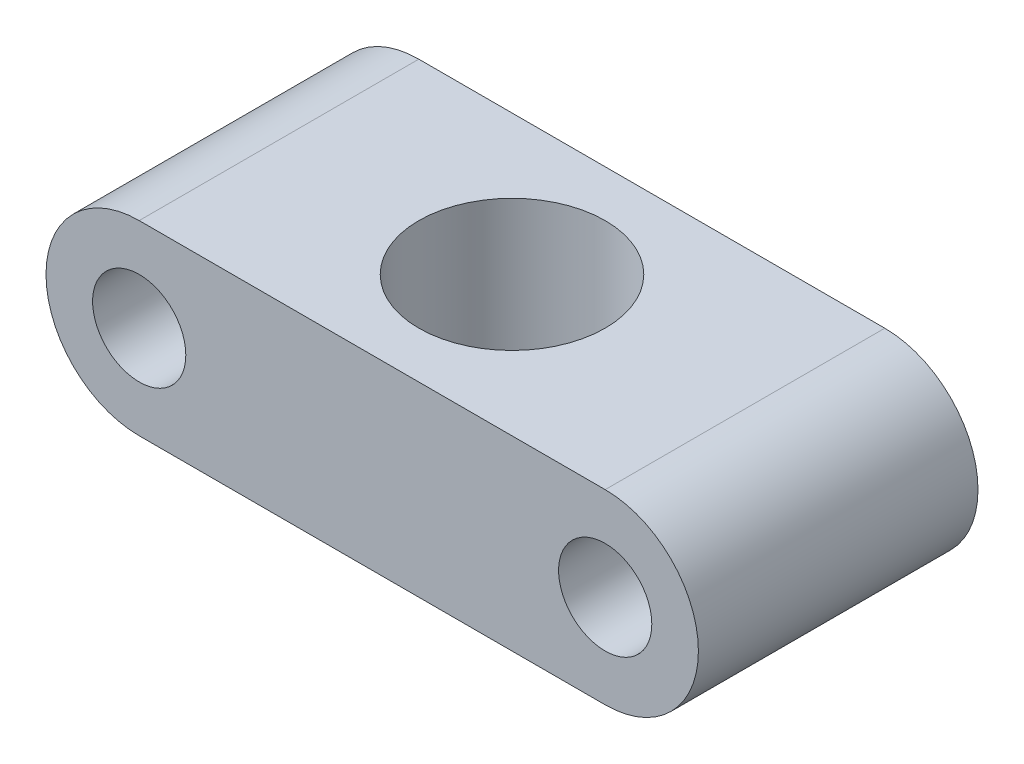
ISO-10303-21;
HEADER;
FILE_DESCRIPTION(('STEP AP214'),'2;1');
FILE_NAME('part.step','',(''),(''),'','','');
FILE_SCHEMA(('AUTOMOTIVE_DESIGN { 1 0 10303 214 1 1 1 1 }'));
ENDSEC;
DATA;
#1=APPLICATION_CONTEXT('core data for automotive mechanical design processes');
#2=APPLICATION_PROTOCOL_DEFINITION('international standard','automotive_design',2000,#1);
#3=PRODUCT_CONTEXT('',#1,'mechanical');
#4=PRODUCT('Part','Part','',(#3));
#5=PRODUCT_RELATED_PRODUCT_CATEGORY('part','',(#4));
#6=PRODUCT_DEFINITION_FORMATION('','',#4);
#7=PRODUCT_DEFINITION_CONTEXT('part definition',#1,'design');
#8=PRODUCT_DEFINITION('design','',#6,#7);
#9=PRODUCT_DEFINITION_SHAPE('','',#8);
#10=(LENGTH_UNIT() NAMED_UNIT(*) SI_UNIT(.MILLI.,.METRE.));
#11=(NAMED_UNIT(*) PLANE_ANGLE_UNIT() SI_UNIT($,.RADIAN.));
#12=(NAMED_UNIT(*) SI_UNIT($,.STERADIAN.) SOLID_ANGLE_UNIT());
#13=UNCERTAINTY_MEASURE_WITH_UNIT(LENGTH_MEASURE(1.E-05),#10,'distance_accuracy_value','');
#14=(GEOMETRIC_REPRESENTATION_CONTEXT(3) GLOBAL_UNCERTAINTY_ASSIGNED_CONTEXT((#13)) GLOBAL_UNIT_ASSIGNED_CONTEXT((#10,
#11,#12)) REPRESENTATION_CONTEXT('',''));
#15=CARTESIAN_POINT('',(0.,0.,0.));
#16=DIRECTION('',(0.,0.,1.));
#17=DIRECTION('',(1.,0.,0.));
#18=AXIS2_PLACEMENT_3D('',#15,#16,#17);
#19=CARTESIAN_POINT('',(-45.9443800806097,11.6908726675388,30.));
#20=DIRECTION('',(0.,0.,1.));
#21=DIRECTION('',(1.,0.,0.));
#22=AXIS2_PLACEMENT_3D('',#19,#20,#21);
#23=PLANE('',#22);
#24=CARTESIAN_POINT('',(-45.9443800806097,11.6908726675388,30.));
#25=DIRECTION('',(0.,0.,1.));
#26=DIRECTION('',(1.,0.,0.));
#27=AXIS2_PLACEMENT_3D('',#24,#25,#26);
#28=CIRCLE('',#27,5.);
#29=CARTESIAN_POINT('',(-40.9443800806097,11.6908726675388,30.));
#30=VERTEX_POINT('',#29);
#31=EDGE_CURVE('E100',#30,#30,#28,.T.);
#32=ORIENTED_EDGE('',*,*,#31,.F.);
#33=EDGE_LOOP('',(#32));
#34=FACE_BOUND('',#33,.T.);
#35=CARTESIAN_POINT('',(-45.9443800806097,11.6908726675388,30.));
#36=DIRECTION('',(0.,0.,1.));
#37=DIRECTION('',(1.,0.,0.));
#38=AXIS2_PLACEMENT_3D('',#35,#36,#37);
#39=CIRCLE('',#38,10.);
#40=CARTESIAN_POINT('',(-45.9443800806097,21.6908726675389,30.));
#41=VERTEX_POINT('',#40);
#42=CARTESIAN_POINT('',(-45.9443800806097,1.69087266753885,30.));
#43=VERTEX_POINT('',#42);
#44=EDGE_CURVE('E85',#41,#43,#39,.T.);
#45=ORIENTED_EDGE('',*,*,#44,.T.);
#46=DIRECTION('',(1.,0.,0.));
#47=VECTOR('',#46,1.);
#48=CARTESIAN_POINT('',(-45.9443800806097,1.69087266753885,30.));
#49=LINE('',#48,#47);
#50=CARTESIAN_POINT('',(4.05561991939028,1.69087266753885,30.));
#51=VERTEX_POINT('',#50);
#52=EDGE_CURVE('E80',#43,#51,#49,.T.);
#53=ORIENTED_EDGE('',*,*,#52,.T.);
#54=CARTESIAN_POINT('',(4.05561991939028,11.6908726675388,30.));
#55=DIRECTION('',(0.,0.,1.));
#56=DIRECTION('',(1.,0.,0.));
#57=AXIS2_PLACEMENT_3D('',#54,#55,#56);
#58=CIRCLE('',#57,10.);
#59=CARTESIAN_POINT('',(4.05561991939028,21.6908726675389,30.));
#60=VERTEX_POINT('',#59);
#61=EDGE_CURVE('E83',#51,#60,#58,.T.);
#62=ORIENTED_EDGE('',*,*,#61,.T.);
#63=DIRECTION('',(-1.,0.,0.));
#64=VECTOR('',#63,1.);
#65=CARTESIAN_POINT('',(-45.9443800806097,21.6908726675389,30.));
#66=LINE('',#65,#64);
#67=EDGE_CURVE('E50',#60,#41,#66,.T.);
#68=ORIENTED_EDGE('',*,*,#67,.T.);
#69=EDGE_LOOP('',(#45,#53,#62,#68));
#70=FACE_BOUND('',#69,.T.);
#71=CARTESIAN_POINT('',(4.05561991939028,11.6908726675388,30.));
#72=DIRECTION('',(0.,0.,1.));
#73=DIRECTION('',(1.,0.,0.));
#74=AXIS2_PLACEMENT_3D('',#71,#72,#73);
#75=CIRCLE('',#74,5.);
#76=CARTESIAN_POINT('',(9.05561991939028,11.6908726675388,30.));
#77=VERTEX_POINT('',#76);
#78=EDGE_CURVE('E115',#77,#77,#75,.T.);
#79=ORIENTED_EDGE('',*,*,#78,.F.);
#80=EDGE_LOOP('',(#79));
#81=FACE_BOUND('',#80,.T.);
#82=ADVANCED_FACE('F33',(#34,#70,#81),#23,.T.);
#83=CARTESIAN_POINT('',(-45.9443800806097,11.6908726675388,0.));
#84=DIRECTION('',(0.,0.,1.));
#85=DIRECTION('',(1.,0.,0.));
#86=AXIS2_PLACEMENT_3D('',#83,#84,#85);
#87=PLANE('',#86);
#88=CARTESIAN_POINT('',(-45.9443800806097,11.6908726675388,0.));
#89=DIRECTION('',(0.,0.,1.));
#90=DIRECTION('',(1.,0.,0.));
#91=AXIS2_PLACEMENT_3D('',#88,#89,#90);
#92=CIRCLE('',#91,10.);
#93=CARTESIAN_POINT('',(-45.9443800806097,21.6908726675389,0.));
#94=VERTEX_POINT('',#93);
#95=CARTESIAN_POINT('',(-45.9443800806097,1.69087266753885,0.));
#96=VERTEX_POINT('',#95);
#97=EDGE_CURVE('E97',#94,#96,#92,.T.);
#98=ORIENTED_EDGE('',*,*,#97,.F.);
#99=DIRECTION('',(-1.,0.,0.));
#100=VECTOR('',#99,1.);
#101=CARTESIAN_POINT('',(-45.9443800806097,21.6908726675389,0.));
#102=LINE('',#101,#100);
#103=CARTESIAN_POINT('',(4.05561991939028,21.6908726675389,0.));
#104=VERTEX_POINT('',#103);
#105=EDGE_CURVE('E73',#104,#94,#102,.T.);
#106=ORIENTED_EDGE('',*,*,#105,.F.);
#107=CARTESIAN_POINT('',(4.05561991939028,11.6908726675388,0.));
#108=DIRECTION('',(0.,0.,1.));
#109=DIRECTION('',(1.,0.,0.));
#110=AXIS2_PLACEMENT_3D('',#107,#108,#109);
#111=CIRCLE('',#110,10.);
#112=CARTESIAN_POINT('',(4.05561991939028,1.69087266753885,0.));
#113=VERTEX_POINT('',#112);
#114=EDGE_CURVE('E67',#113,#104,#111,.T.);
#115=ORIENTED_EDGE('',*,*,#114,.F.);
#116=DIRECTION('',(1.,0.,0.));
#117=VECTOR('',#116,1.);
#118=CARTESIAN_POINT('',(-45.9443800806097,1.69087266753885,0.));
#119=LINE('',#118,#117);
#120=EDGE_CURVE('E89',#96,#113,#119,.T.);
#121=ORIENTED_EDGE('',*,*,#120,.F.);
#122=EDGE_LOOP('',(#98,#106,#115,#121));
#123=FACE_BOUND('',#122,.T.);
#124=CARTESIAN_POINT('',(-45.9443800806097,11.6908726675388,0.));
#125=DIRECTION('',(0.,0.,1.));
#126=DIRECTION('',(1.,0.,0.));
#127=AXIS2_PLACEMENT_3D('',#124,#125,#126);
#128=CIRCLE('',#127,5.);
#129=CARTESIAN_POINT('',(-40.9443800806097,11.6908726675388,0.));
#130=VERTEX_POINT('',#129);
#131=EDGE_CURVE('E112',#130,#130,#128,.T.);
#132=ORIENTED_EDGE('',*,*,#131,.T.);
#133=EDGE_LOOP('',(#132));
#134=FACE_BOUND('',#133,.T.);
#135=CARTESIAN_POINT('',(4.05561991939028,11.6908726675388,0.));
#136=DIRECTION('',(0.,0.,1.));
#137=DIRECTION('',(1.,0.,0.));
#138=AXIS2_PLACEMENT_3D('',#135,#136,#137);
#139=CIRCLE('',#138,5.);
#140=CARTESIAN_POINT('',(9.05561991939028,11.6908726675388,0.));
#141=VERTEX_POINT('',#140);
#142=EDGE_CURVE('E118',#141,#141,#139,.T.);
#143=ORIENTED_EDGE('',*,*,#142,.T.);
#144=EDGE_LOOP('',(#143));
#145=FACE_BOUND('',#144,.T.);
#146=ADVANCED_FACE('F108',(#123,#134,#145),#87,.F.);
#147=CARTESIAN_POINT('',(-45.9443800806097,11.6908726675388,30.));
#148=DIRECTION('',(0.,0.,-1.));
#149=DIRECTION('',(-1.,0.,0.));
#150=AXIS2_PLACEMENT_3D('',#147,#148,#149);
#151=CYLINDRICAL_SURFACE('',#150,10.);
#152=ORIENTED_EDGE('',*,*,#97,.T.);
#153=DIRECTION('',(0.,0.,-1.));
#154=VECTOR('',#153,1.);
#155=CARTESIAN_POINT('',(-45.9443800806097,1.69087266753885,30.));
#156=LINE('',#155,#154);
#157=EDGE_CURVE('E11',#43,#96,#156,.T.);
#158=ORIENTED_EDGE('',*,*,#157,.F.);
#159=ORIENTED_EDGE('',*,*,#44,.F.);
#160=DIRECTION('',(0.,0.,-1.));
#161=VECTOR('',#160,1.);
#162=CARTESIAN_POINT('',(-45.9443800806097,21.6908726675389,30.));
#163=LINE('',#162,#161);
#164=EDGE_CURVE('E93',#41,#94,#163,.T.);
#165=ORIENTED_EDGE('',*,*,#164,.T.);
#166=EDGE_LOOP('',(#152,#158,#159,#165));
#167=FACE_BOUND('',#166,.T.);
#168=ADVANCED_FACE('F35',(#167),#151,.T.);
#169=CARTESIAN_POINT('',(-45.9443800806097,1.69087266753885,30.));
#170=DIRECTION('',(0.,1.,0.));
#171=DIRECTION('',(0.,0.,1.));
#172=AXIS2_PLACEMENT_3D('',#169,#170,#171);
#173=PLANE('',#172);
#174=CARTESIAN_POINT('',(-20.9443800806097,1.69087266753885,15.));
#175=DIRECTION('',(0.,1.,0.));
#176=DIRECTION('',(0.,0.,1.));
#177=AXIS2_PLACEMENT_3D('',#174,#175,#176);
#178=CIRCLE('',#177,10.);
#179=CARTESIAN_POINT('',(-20.9443800806097,1.69087266753885,25.));
#180=VERTEX_POINT('',#179);
#181=EDGE_CURVE('E121',#180,#180,#178,.T.);
#182=ORIENTED_EDGE('',*,*,#181,.T.);
#183=EDGE_LOOP('',(#182));
#184=FACE_BOUND('',#183,.T.);
#185=ORIENTED_EDGE('',*,*,#120,.T.);
#186=DIRECTION('',(0.,0.,-1.));
#187=VECTOR('',#186,1.);
#188=CARTESIAN_POINT('',(4.05561991939028,1.69087266753885,30.));
#189=LINE('',#188,#187);
#190=EDGE_CURVE('E42',#51,#113,#189,.T.);
#191=ORIENTED_EDGE('',*,*,#190,.F.);
#192=ORIENTED_EDGE('',*,*,#52,.F.);
#193=ORIENTED_EDGE('',*,*,#157,.T.);
#194=EDGE_LOOP('',(#185,#191,#192,#193));
#195=FACE_BOUND('',#194,.T.);
#196=ADVANCED_FACE('F88',(#184,#195),#173,.F.);
#197=CARTESIAN_POINT('',(4.05561991939028,11.6908726675388,30.));
#198=DIRECTION('',(0.,0.,-1.));
#199=DIRECTION('',(-1.,0.,0.));
#200=AXIS2_PLACEMENT_3D('',#197,#198,#199);
#201=CYLINDRICAL_SURFACE('',#200,10.);
#202=ORIENTED_EDGE('',*,*,#114,.T.);
#203=DIRECTION('',(0.,0.,-1.));
#204=VECTOR('',#203,1.);
#205=CARTESIAN_POINT('',(4.05561991939028,21.6908726675389,30.));
#206=LINE('',#205,#204);
#207=EDGE_CURVE('E90',#60,#104,#206,.T.);
#208=ORIENTED_EDGE('',*,*,#207,.F.);
#209=ORIENTED_EDGE('',*,*,#61,.F.);
#210=ORIENTED_EDGE('',*,*,#190,.T.);
#211=EDGE_LOOP('',(#202,#208,#209,#210));
#212=FACE_BOUND('',#211,.T.);
#213=ADVANCED_FACE('F91',(#212),#201,.T.);
#214=CARTESIAN_POINT('',(-45.9443800806097,21.6908726675389,30.));
#215=DIRECTION('',(0.,-1.,0.));
#216=DIRECTION('',(0.,0.,-1.));
#217=AXIS2_PLACEMENT_3D('',#214,#215,#216);
#218=PLANE('',#217);
#219=CARTESIAN_POINT('',(-20.9443800806097,21.6908726675389,15.));
#220=DIRECTION('',(0.,1.,0.));
#221=DIRECTION('',(0.,0.,1.));
#222=AXIS2_PLACEMENT_3D('',#219,#220,#221);
#223=CIRCLE('',#222,10.);
#224=CARTESIAN_POINT('',(-20.9443800806097,21.6908726675389,25.));
#225=VERTEX_POINT('',#224);
#226=EDGE_CURVE('E124',#225,#225,#223,.T.);
#227=ORIENTED_EDGE('',*,*,#226,.F.);
#228=EDGE_LOOP('',(#227));
#229=FACE_BOUND('',#228,.T.);
#230=ORIENTED_EDGE('',*,*,#105,.T.);
#231=ORIENTED_EDGE('',*,*,#164,.F.);
#232=ORIENTED_EDGE('',*,*,#67,.F.);
#233=ORIENTED_EDGE('',*,*,#207,.T.);
#234=EDGE_LOOP('',(#230,#231,#232,#233));
#235=FACE_BOUND('',#234,.T.);
#236=ADVANCED_FACE('F105',(#229,#235),#218,.F.);
#237=CARTESIAN_POINT('',(-45.9443800806097,11.6908726675388,30.));
#238=DIRECTION('',(0.,0.,-1.));
#239=DIRECTION('',(-1.,0.,0.));
#240=AXIS2_PLACEMENT_3D('',#237,#238,#239);
#241=CYLINDRICAL_SURFACE('',#240,5.);
#242=ORIENTED_EDGE('',*,*,#31,.T.);
#243=EDGE_LOOP('',(#242));
#244=FACE_BOUND('',#243,.T.);
#245=ORIENTED_EDGE('',*,*,#131,.F.);
#246=EDGE_LOOP('',(#245));
#247=FACE_BOUND('',#246,.T.);
#248=ADVANCED_FACE('F139',(#244,#247),#241,.F.);
#249=CARTESIAN_POINT('',(4.05561991939028,11.6908726675388,30.));
#250=DIRECTION('',(0.,0.,-1.));
#251=DIRECTION('',(-1.,0.,0.));
#252=AXIS2_PLACEMENT_3D('',#249,#250,#251);
#253=CYLINDRICAL_SURFACE('',#252,5.);
#254=ORIENTED_EDGE('',*,*,#78,.T.);
#255=EDGE_LOOP('',(#254));
#256=FACE_BOUND('',#255,.T.);
#257=ORIENTED_EDGE('',*,*,#142,.F.);
#258=EDGE_LOOP('',(#257));
#259=FACE_BOUND('',#258,.T.);
#260=ADVANCED_FACE('F134',(#256,#259),#253,.F.);
#261=CARTESIAN_POINT('',(-20.9443800806097,1.69087266753885,15.));
#262=DIRECTION('',(0.,1.,0.));
#263=DIRECTION('',(0.,0.,1.));
#264=AXIS2_PLACEMENT_3D('',#261,#262,#263);
#265=CYLINDRICAL_SURFACE('',#264,10.);
#266=ORIENTED_EDGE('',*,*,#181,.F.);
#267=EDGE_LOOP('',(#266));
#268=FACE_BOUND('',#267,.T.);
#269=ORIENTED_EDGE('',*,*,#226,.T.);
#270=EDGE_LOOP('',(#269));
#271=FACE_BOUND('',#270,.T.);
#272=ADVANCED_FACE('F131',(#268,#271),#265,.F.);
#273=CLOSED_SHELL('',(#82,#146,#168,#196,#213,#236,#248,#260,#272));
#274=MANIFOLD_SOLID_BREP('B2',#273);
#275=ADVANCED_BREP_SHAPE_REPRESENTATION('',(#18,#274),#14);
#276=SHAPE_DEFINITION_REPRESENTATION(#9,#275);
ENDSEC;
END-ISO-10303-21;
